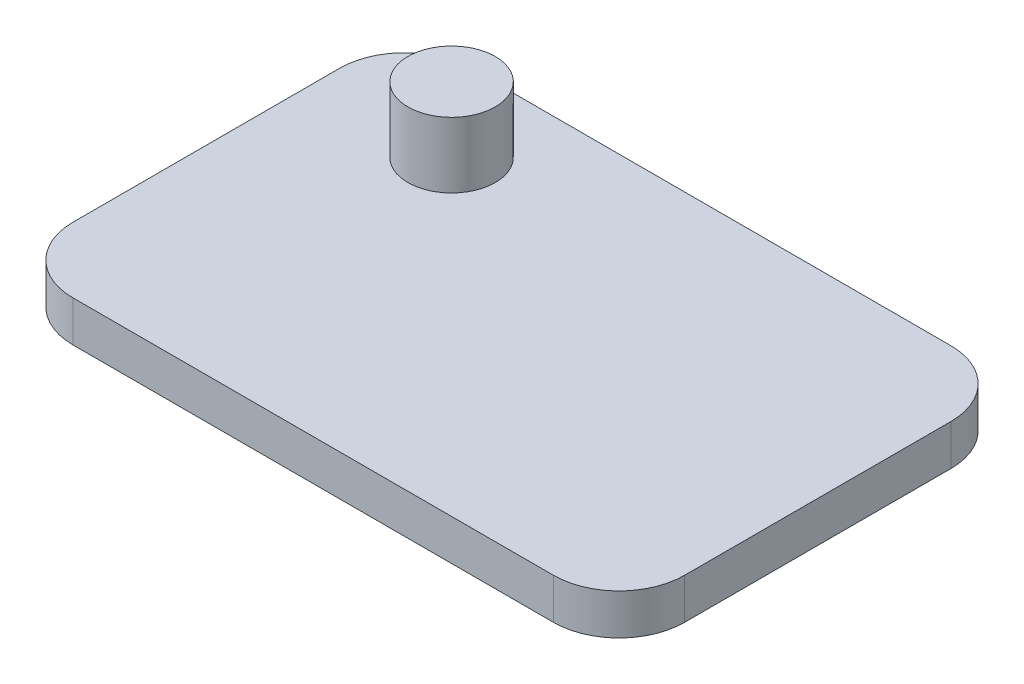
ISO-10303-21;
HEADER;
FILE_DESCRIPTION(('STEP AP214'),'2;1');
FILE_NAME('part.step','',(''),(''),'','','');
FILE_SCHEMA(('AUTOMOTIVE_DESIGN { 1 0 10303 214 1 1 1 1 }'));
ENDSEC;
DATA;
#1=APPLICATION_CONTEXT('core data for automotive mechanical design processes');
#2=APPLICATION_PROTOCOL_DEFINITION('international standard','automotive_design',2000,#1);
#3=PRODUCT_CONTEXT('',#1,'mechanical');
#4=PRODUCT('Part','Part','',(#3));
#5=PRODUCT_RELATED_PRODUCT_CATEGORY('part','',(#4));
#6=PRODUCT_DEFINITION_FORMATION('','',#4);
#7=PRODUCT_DEFINITION_CONTEXT('part definition',#1,'design');
#8=PRODUCT_DEFINITION('design','',#6,#7);
#9=PRODUCT_DEFINITION_SHAPE('','',#8);
#10=(LENGTH_UNIT() NAMED_UNIT(*) SI_UNIT(.MILLI.,.METRE.));
#11=(NAMED_UNIT(*) PLANE_ANGLE_UNIT() SI_UNIT($,.RADIAN.));
#12=(NAMED_UNIT(*) SI_UNIT($,.STERADIAN.) SOLID_ANGLE_UNIT());
#13=UNCERTAINTY_MEASURE_WITH_UNIT(LENGTH_MEASURE(1.E-05),#10,'distance_accuracy_value','');
#14=(GEOMETRIC_REPRESENTATION_CONTEXT(3) GLOBAL_UNCERTAINTY_ASSIGNED_CONTEXT((#13)) GLOBAL_UNIT_ASSIGNED_CONTEXT((#10,
#11,#12)) REPRESENTATION_CONTEXT('',''));
#15=CARTESIAN_POINT('',(0.,0.,0.));
#16=DIRECTION('',(0.,0.,1.));
#17=DIRECTION('',(1.,0.,0.));
#18=AXIS2_PLACEMENT_3D('',#15,#16,#17);
#19=CARTESIAN_POINT('',(-711.2,-94.8266666666667,462.28));
#20=DIRECTION('',(1.,0.,0.));
#21=DIRECTION('',(0.,0.,-1.));
#22=AXIS2_PLACEMENT_3D('',#19,#20,#21);
#23=PLANE('',#22);
#24=DIRECTION('',(0.,0.,-1.));
#25=VECTOR('',#24,1.);
#26=CARTESIAN_POINT('',(-711.2,0.,462.28));
#27=LINE('',#26,#25);
#28=CARTESIAN_POINT('',(-711.2,0.,309.88));
#29=VERTEX_POINT('',#28);
#30=CARTESIAN_POINT('',(-711.2,0.,-309.88));
#31=VERTEX_POINT('',#30);
#32=EDGE_CURVE('E127',#29,#31,#27,.T.);
#33=ORIENTED_EDGE('',*,*,#32,.T.);
#34=DIRECTION('',(0.,1.,0.));
#35=VECTOR('',#34,1.);
#36=CARTESIAN_POINT('',(-711.2,-94.8266666666667,-309.88));
#37=LINE('',#36,#35);
#38=CARTESIAN_POINT('',(-711.2,-94.8266666666667,-309.88));
#39=VERTEX_POINT('',#38);
#40=EDGE_CURVE('E105',#31,#39,#37,.F.);
#41=ORIENTED_EDGE('',*,*,#40,.T.);
#42=DIRECTION('',(0.,0.,-1.));
#43=VECTOR('',#42,1.);
#44=CARTESIAN_POINT('',(-711.2,-94.8266666666667,462.28));
#45=LINE('',#44,#43);
#46=CARTESIAN_POINT('',(-711.2,-94.8266666666667,309.88));
#47=VERTEX_POINT('',#46);
#48=EDGE_CURVE('E137',#47,#39,#45,.T.);
#49=ORIENTED_EDGE('',*,*,#48,.F.);
#50=DIRECTION('',(0.,1.,0.));
#51=VECTOR('',#50,1.);
#52=CARTESIAN_POINT('',(-711.2,0.,309.88));
#53=LINE('',#52,#51);
#54=EDGE_CURVE('E110',#47,#29,#53,.T.);
#55=ORIENTED_EDGE('',*,*,#54,.T.);
#56=EDGE_LOOP('',(#33,#41,#49,#55));
#57=FACE_BOUND('',#56,.T.);
#58=ADVANCED_FACE('F33',(#57),#23,.F.);
#59=CARTESIAN_POINT('',(-711.2,-94.8266666666667,-462.28));
#60=DIRECTION('',(0.,0.,1.));
#61=DIRECTION('',(1.,0.,0.));
#62=AXIS2_PLACEMENT_3D('',#59,#60,#61);
#63=PLANE('',#62);
#64=DIRECTION('',(1.,0.,0.));
#65=VECTOR('',#64,1.);
#66=CARTESIAN_POINT('',(-711.2,-94.8266666666667,-462.28));
#67=LINE('',#66,#65);
#68=CARTESIAN_POINT('',(-558.8,-94.8266666666667,-462.28));
#69=VERTEX_POINT('',#68);
#70=CARTESIAN_POINT('',(558.8,-94.8266666666667,-462.28));
#71=VERTEX_POINT('',#70);
#72=EDGE_CURVE('E120',#69,#71,#67,.T.);
#73=ORIENTED_EDGE('',*,*,#72,.F.);
#74=DIRECTION('',(0.,1.,0.));
#75=VECTOR('',#74,1.);
#76=CARTESIAN_POINT('',(-558.8,-94.8266666666667,-462.28));
#77=LINE('',#76,#75);
#78=CARTESIAN_POINT('',(-558.8,0.,-462.28));
#79=VERTEX_POINT('',#78);
#80=EDGE_CURVE('E104',#69,#79,#77,.T.);
#81=ORIENTED_EDGE('',*,*,#80,.T.);
#82=DIRECTION('',(1.,0.,0.));
#83=VECTOR('',#82,1.);
#84=CARTESIAN_POINT('',(-711.2,0.,-462.28));
#85=LINE('',#84,#83);
#86=CARTESIAN_POINT('',(558.8,0.,-462.28));
#87=VERTEX_POINT('',#86);
#88=EDGE_CURVE('E117',#79,#87,#85,.T.);
#89=ORIENTED_EDGE('',*,*,#88,.T.);
#90=DIRECTION('',(0.,1.,0.));
#91=VECTOR('',#90,1.);
#92=CARTESIAN_POINT('',(558.8,-94.8266666666667,-462.28));
#93=LINE('',#92,#91);
#94=EDGE_CURVE('E122',#87,#71,#93,.F.);
#95=ORIENTED_EDGE('',*,*,#94,.T.);
#96=EDGE_LOOP('',(#73,#81,#89,#95));
#97=FACE_BOUND('',#96,.T.);
#98=ADVANCED_FACE('F116',(#97),#63,.F.);
#99=CARTESIAN_POINT('',(711.2,-94.8266666666667,462.28));
#100=DIRECTION('',(1.,0.,0.));
#101=DIRECTION('',(0.,0.,-1.));
#102=AXIS2_PLACEMENT_3D('',#99,#100,#101);
#103=PLANE('',#102);
#104=DIRECTION('',(0.,0.,-1.));
#105=VECTOR('',#104,1.);
#106=CARTESIAN_POINT('',(711.2,-94.8266666666667,462.28));
#107=LINE('',#106,#105);
#108=CARTESIAN_POINT('',(711.2,-94.8266666666667,309.88));
#109=VERTEX_POINT('',#108);
#110=CARTESIAN_POINT('',(711.2,-94.8266666666667,-309.88));
#111=VERTEX_POINT('',#110);
#112=EDGE_CURVE('E171',#109,#111,#107,.T.);
#113=ORIENTED_EDGE('',*,*,#112,.T.);
#114=DIRECTION('',(0.,1.,0.));
#115=VECTOR('',#114,1.);
#116=CARTESIAN_POINT('',(711.2,0.,-309.88));
#117=LINE('',#116,#115);
#118=CARTESIAN_POINT('',(711.2,0.,-309.88));
#119=VERTEX_POINT('',#118);
#120=EDGE_CURVE('E156',#111,#119,#117,.T.);
#121=ORIENTED_EDGE('',*,*,#120,.T.);
#122=DIRECTION('',(0.,0.,-1.));
#123=VECTOR('',#122,1.);
#124=CARTESIAN_POINT('',(711.2,0.,462.28));
#125=LINE('',#124,#123);
#126=CARTESIAN_POINT('',(711.2,0.,309.88));
#127=VERTEX_POINT('',#126);
#128=EDGE_CURVE('E126',#127,#119,#125,.T.);
#129=ORIENTED_EDGE('',*,*,#128,.F.);
#130=DIRECTION('',(0.,1.,0.));
#131=VECTOR('',#130,1.);
#132=CARTESIAN_POINT('',(711.2,-94.8266666666667,309.88));
#133=LINE('',#132,#131);
#134=EDGE_CURVE('E154',#127,#109,#133,.F.);
#135=ORIENTED_EDGE('',*,*,#134,.T.);
#136=EDGE_LOOP('',(#113,#121,#129,#135));
#137=FACE_BOUND('',#136,.T.);
#138=ADVANCED_FACE('F178',(#137),#103,.T.);
#139=CARTESIAN_POINT('',(-711.2,-94.8266666666667,462.28));
#140=DIRECTION('',(0.,0.,1.));
#141=DIRECTION('',(1.,0.,0.));
#142=AXIS2_PLACEMENT_3D('',#139,#140,#141);
#143=PLANE('',#142);
#144=DIRECTION('',(1.,0.,0.));
#145=VECTOR('',#144,1.);
#146=CARTESIAN_POINT('',(-711.2,-94.8266666666667,462.28));
#147=LINE('',#146,#145);
#148=CARTESIAN_POINT('',(-558.8,-94.8266666666667,462.28));
#149=VERTEX_POINT('',#148);
#150=CARTESIAN_POINT('',(558.8,-94.8266666666667,462.28));
#151=VERTEX_POINT('',#150);
#152=EDGE_CURVE('E138',#149,#151,#147,.T.);
#153=ORIENTED_EDGE('',*,*,#152,.T.);
#154=DIRECTION('',(0.,1.,0.));
#155=VECTOR('',#154,1.);
#156=CARTESIAN_POINT('',(558.8,-94.8266666666667,462.28));
#157=LINE('',#156,#155);
#158=CARTESIAN_POINT('',(558.8,0.,462.28));
#159=VERTEX_POINT('',#158);
#160=EDGE_CURVE('E41',#151,#159,#157,.T.);
#161=ORIENTED_EDGE('',*,*,#160,.T.);
#162=DIRECTION('',(1.,0.,0.));
#163=VECTOR('',#162,1.);
#164=CARTESIAN_POINT('',(-711.2,0.,462.28));
#165=LINE('',#164,#163);
#166=CARTESIAN_POINT('',(-558.8,0.,462.28));
#167=VERTEX_POINT('',#166);
#168=EDGE_CURVE('E129',#167,#159,#165,.T.);
#169=ORIENTED_EDGE('',*,*,#168,.F.);
#170=DIRECTION('',(0.,1.,0.));
#171=VECTOR('',#170,1.);
#172=CARTESIAN_POINT('',(-558.8,-94.8266666666667,462.28));
#173=LINE('',#172,#171);
#174=EDGE_CURVE('E55',#167,#149,#173,.F.);
#175=ORIENTED_EDGE('',*,*,#174,.T.);
#176=EDGE_LOOP('',(#153,#161,#169,#175));
#177=FACE_BOUND('',#176,.T.);
#178=ADVANCED_FACE('F161',(#177),#143,.T.);
#179=CARTESIAN_POINT('',(0.,-94.8266666666667,0.));
#180=DIRECTION('',(0.,-1.,0.));
#181=DIRECTION('',(0.,0.,-1.));
#182=AXIS2_PLACEMENT_3D('',#179,#180,#181);
#183=PLANE('',#182);
#184=ORIENTED_EDGE('',*,*,#48,.T.);
#185=CARTESIAN_POINT('',(-558.8,-94.8266666666667,-309.88));
#186=DIRECTION('',(0.,-1.,0.));
#187=DIRECTION('',(0.,0.,-1.));
#188=AXIS2_PLACEMENT_3D('',#185,#186,#187);
#189=CIRCLE('',#188,152.4);
#190=EDGE_CURVE('E152',#39,#69,#189,.T.);
#191=ORIENTED_EDGE('',*,*,#190,.T.);
#192=ORIENTED_EDGE('',*,*,#72,.T.);
#193=CARTESIAN_POINT('',(558.8,-94.8266666666667,-309.88));
#194=DIRECTION('',(0.,-1.,0.));
#195=DIRECTION('',(0.,0.,-1.));
#196=AXIS2_PLACEMENT_3D('',#193,#194,#195);
#197=CIRCLE('',#196,152.4);
#198=EDGE_CURVE('E150',#71,#111,#197,.T.);
#199=ORIENTED_EDGE('',*,*,#198,.T.);
#200=ORIENTED_EDGE('',*,*,#112,.F.);
#201=CARTESIAN_POINT('',(558.8,-94.8266666666667,309.88));
#202=DIRECTION('',(0.,-1.,0.));
#203=DIRECTION('',(0.,0.,-1.));
#204=AXIS2_PLACEMENT_3D('',#201,#202,#203);
#205=CIRCLE('',#204,152.4);
#206=EDGE_CURVE('E48',#109,#151,#205,.T.);
#207=ORIENTED_EDGE('',*,*,#206,.T.);
#208=ORIENTED_EDGE('',*,*,#152,.F.);
#209=CARTESIAN_POINT('',(-558.8,-94.8266666666667,309.88));
#210=DIRECTION('',(0.,-1.,0.));
#211=DIRECTION('',(0.,0.,-1.));
#212=AXIS2_PLACEMENT_3D('',#209,#210,#211);
#213=CIRCLE('',#212,152.4);
#214=EDGE_CURVE('E147',#149,#47,#213,.T.);
#215=ORIENTED_EDGE('',*,*,#214,.T.);
#216=EDGE_LOOP('',(#184,#191,#192,#199,#200,#207,#208,#215));
#217=FACE_BOUND('',#216,.T.);
#218=ADVANCED_FACE('F183',(#217),#183,.T.);
#219=CARTESIAN_POINT('',(0.,0.,0.));
#220=DIRECTION('',(0.,-1.,0.));
#221=DIRECTION('',(0.,0.,-1.));
#222=AXIS2_PLACEMENT_3D('',#219,#220,#221);
#223=PLANE('',#222);
#224=CARTESIAN_POINT('',(-401.553909640909,0.,-261.010041266591));
#225=DIRECTION('',(0.,-1.,0.));
#226=DIRECTION('',(0.,0.,-1.));
#227=AXIS2_PLACEMENT_3D('',#224,#225,#226);
#228=CIRCLE('',#227,101.6);
#229=CARTESIAN_POINT('',(-401.553909640909,0.,-362.610041266591));
#230=VERTEX_POINT('',#229);
#231=EDGE_CURVE('E11',#230,#230,#228,.F.);
#232=ORIENTED_EDGE('',*,*,#231,.F.);
#233=EDGE_LOOP('',(#232));
#234=FACE_BOUND('',#233,.T.);
#235=ORIENTED_EDGE('',*,*,#88,.F.);
#236=CARTESIAN_POINT('',(-558.8,0.,-309.88));
#237=DIRECTION('',(0.,-1.,0.));
#238=DIRECTION('',(0.,0.,-1.));
#239=AXIS2_PLACEMENT_3D('',#236,#237,#238);
#240=CIRCLE('',#239,152.4);
#241=EDGE_CURVE('E100',#79,#31,#240,.F.);
#242=ORIENTED_EDGE('',*,*,#241,.T.);
#243=ORIENTED_EDGE('',*,*,#32,.F.);
#244=CARTESIAN_POINT('',(-558.8,0.,309.88));
#245=DIRECTION('',(0.,-1.,0.));
#246=DIRECTION('',(0.,0.,-1.));
#247=AXIS2_PLACEMENT_3D('',#244,#245,#246);
#248=CIRCLE('',#247,152.4);
#249=EDGE_CURVE('E121',#29,#167,#248,.F.);
#250=ORIENTED_EDGE('',*,*,#249,.T.);
#251=ORIENTED_EDGE('',*,*,#168,.T.);
#252=CARTESIAN_POINT('',(558.8,0.,309.88));
#253=DIRECTION('',(0.,-1.,0.));
#254=DIRECTION('',(0.,0.,-1.));
#255=AXIS2_PLACEMENT_3D('',#252,#253,#254);
#256=CIRCLE('',#255,152.4);
#257=EDGE_CURVE('E141',#159,#127,#256,.F.);
#258=ORIENTED_EDGE('',*,*,#257,.T.);
#259=ORIENTED_EDGE('',*,*,#128,.T.);
#260=CARTESIAN_POINT('',(558.8,0.,-309.88));
#261=DIRECTION('',(0.,-1.,0.));
#262=DIRECTION('',(0.,0.,-1.));
#263=AXIS2_PLACEMENT_3D('',#260,#261,#262);
#264=CIRCLE('',#263,152.4);
#265=EDGE_CURVE('E111',#119,#87,#264,.F.);
#266=ORIENTED_EDGE('',*,*,#265,.T.);
#267=EDGE_LOOP('',(#235,#242,#243,#250,#251,#258,#259,#266));
#268=FACE_BOUND('',#267,.T.);
#269=ADVANCED_FACE('F124',(#234,#268),#223,.F.);
#270=CARTESIAN_POINT('',(-558.8,-94.8266666666667,-309.88));
#271=DIRECTION('',(0.,1.,0.));
#272=DIRECTION('',(0.,0.,1.));
#273=AXIS2_PLACEMENT_3D('',#270,#271,#272);
#274=CYLINDRICAL_SURFACE('',#273,152.4);
#275=ORIENTED_EDGE('',*,*,#190,.F.);
#276=ORIENTED_EDGE('',*,*,#40,.F.);
#277=ORIENTED_EDGE('',*,*,#241,.F.);
#278=ORIENTED_EDGE('',*,*,#80,.F.);
#279=EDGE_LOOP('',(#275,#276,#277,#278));
#280=FACE_BOUND('',#279,.T.);
#281=ADVANCED_FACE('F103',(#280),#274,.T.);
#282=CARTESIAN_POINT('',(558.8,-94.8266666666667,-309.88));
#283=DIRECTION('',(0.,-1.,0.));
#284=DIRECTION('',(0.,0.,-1.));
#285=AXIS2_PLACEMENT_3D('',#282,#283,#284);
#286=CYLINDRICAL_SURFACE('',#285,152.4);
#287=ORIENTED_EDGE('',*,*,#198,.F.);
#288=ORIENTED_EDGE('',*,*,#94,.F.);
#289=ORIENTED_EDGE('',*,*,#265,.F.);
#290=ORIENTED_EDGE('',*,*,#120,.F.);
#291=EDGE_LOOP('',(#287,#288,#289,#290));
#292=FACE_BOUND('',#291,.T.);
#293=ADVANCED_FACE('F182',(#292),#286,.T.);
#294=CARTESIAN_POINT('',(558.8,-94.8266666666667,309.88));
#295=DIRECTION('',(0.,1.,0.));
#296=DIRECTION('',(0.,0.,1.));
#297=AXIS2_PLACEMENT_3D('',#294,#295,#296);
#298=CYLINDRICAL_SURFACE('',#297,152.4);
#299=ORIENTED_EDGE('',*,*,#206,.F.);
#300=ORIENTED_EDGE('',*,*,#134,.F.);
#301=ORIENTED_EDGE('',*,*,#257,.F.);
#302=ORIENTED_EDGE('',*,*,#160,.F.);
#303=EDGE_LOOP('',(#299,#300,#301,#302));
#304=FACE_BOUND('',#303,.T.);
#305=ADVANCED_FACE('F206',(#304),#298,.T.);
#306=CARTESIAN_POINT('',(-558.8,-94.8266666666667,309.88));
#307=DIRECTION('',(0.,-1.,0.));
#308=DIRECTION('',(0.,0.,-1.));
#309=AXIS2_PLACEMENT_3D('',#306,#307,#308);
#310=CYLINDRICAL_SURFACE('',#309,152.4);
#311=ORIENTED_EDGE('',*,*,#214,.F.);
#312=ORIENTED_EDGE('',*,*,#174,.F.);
#313=ORIENTED_EDGE('',*,*,#249,.F.);
#314=ORIENTED_EDGE('',*,*,#54,.F.);
#315=EDGE_LOOP('',(#311,#312,#313,#314));
#316=FACE_BOUND('',#315,.T.);
#317=ADVANCED_FACE('F35',(#316),#310,.T.);
#318=CARTESIAN_POINT('',(-401.553909640909,152.4,-261.010041266591));
#319=DIRECTION('',(0.,-1.,0.));
#320=DIRECTION('',(0.,0.,-1.));
#321=AXIS2_PLACEMENT_3D('',#318,#319,#320);
#322=CYLINDRICAL_SURFACE('',#321,101.6);
#323=CARTESIAN_POINT('',(-401.553909640909,152.4,-261.010041266591));
#324=DIRECTION('',(0.,1.,0.));
#325=DIRECTION('',(0.,0.,1.));
#326=AXIS2_PLACEMENT_3D('',#323,#324,#325);
#327=CIRCLE('',#326,101.6);
#328=CARTESIAN_POINT('',(-401.553909640909,152.4,-362.610041266591));
#329=VERTEX_POINT('',#328);
#330=EDGE_CURVE('E131',#329,#329,#327,.T.);
#331=CARTESIAN_POINT('',(-401.553909640909,152.4,-362.610041266591));
#332=CARTESIAN_POINT('',(-401.553909640909,150.8125,-362.610041266591));
#333=CARTESIAN_POINT('',(-401.553909640909,149.225,-362.610041266591));
#334=CARTESIAN_POINT('',(-401.553909640909,146.05,-362.610041266591));
#335=CARTESIAN_POINT('',(-401.553909640909,144.4625,-362.610041266591));
#336=CARTESIAN_POINT('',(-401.553909640909,141.2875,-362.610041266591));
#337=CARTESIAN_POINT('',(-401.553909640909,139.7,-362.610041266591));
#338=CARTESIAN_POINT('',(-401.553909640909,136.525,-362.610041266591));
#339=CARTESIAN_POINT('',(-401.553909640909,134.9375,-362.610041266591));
#340=CARTESIAN_POINT('',(-401.553909640909,131.7625,-362.610041266591));
#341=CARTESIAN_POINT('',(-401.553909640909,130.175,-362.610041266591));
#342=CARTESIAN_POINT('',(-401.553909640909,127.,-362.610041266591));
#343=CARTESIAN_POINT('',(-401.553909640909,125.4125,-362.610041266591));
#344=CARTESIAN_POINT('',(-401.553909640909,122.2375,-362.610041266591));
#345=CARTESIAN_POINT('',(-401.553909640909,120.65,-362.610041266591));
#346=CARTESIAN_POINT('',(-401.553909640909,117.475,-362.610041266591));
#347=CARTESIAN_POINT('',(-401.553909640909,115.8875,-362.610041266591));
#348=CARTESIAN_POINT('',(-401.553909640909,112.7125,-362.610041266591));
#349=CARTESIAN_POINT('',(-401.553909640909,111.125,-362.610041266591));
#350=CARTESIAN_POINT('',(-401.553909640909,107.95,-362.610041266591));
#351=CARTESIAN_POINT('',(-401.553909640909,106.3625,-362.610041266591));
#352=CARTESIAN_POINT('',(-401.553909640909,103.1875,-362.610041266591));
#353=CARTESIAN_POINT('',(-401.553909640909,101.6,-362.610041266591));
#354=CARTESIAN_POINT('',(-401.553909640909,98.425,-362.610041266591));
#355=CARTESIAN_POINT('',(-401.553909640909,96.8375,-362.610041266591));
#356=CARTESIAN_POINT('',(-401.553909640909,93.6625,-362.610041266591));
#357=CARTESIAN_POINT('',(-401.553909640909,92.075,-362.610041266591));
#358=CARTESIAN_POINT('',(-401.553909640909,88.9,-362.610041266591));
#359=CARTESIAN_POINT('',(-401.553909640909,87.3125,-362.610041266591));
#360=CARTESIAN_POINT('',(-401.553909640909,84.1375,-362.610041266591));
#361=CARTESIAN_POINT('',(-401.553909640909,82.55,-362.610041266591));
#362=CARTESIAN_POINT('',(-401.553909640909,79.375,-362.610041266591));
#363=CARTESIAN_POINT('',(-401.553909640909,77.7875,-362.610041266591));
#364=CARTESIAN_POINT('',(-401.553909640909,74.6125,-362.610041266591));
#365=CARTESIAN_POINT('',(-401.553909640909,73.025,-362.610041266591));
#366=CARTESIAN_POINT('',(-401.553909640909,69.85,-362.610041266591));
#367=CARTESIAN_POINT('',(-401.553909640909,68.2625,-362.610041266591));
#368=CARTESIAN_POINT('',(-401.553909640909,65.0875,-362.610041266591));
#369=CARTESIAN_POINT('',(-401.553909640909,63.5,-362.610041266591));
#370=CARTESIAN_POINT('',(-401.553909640909,60.325,-362.610041266591));
#371=CARTESIAN_POINT('',(-401.553909640909,58.7375,-362.610041266591));
#372=CARTESIAN_POINT('',(-401.553909640909,55.5625,-362.610041266591));
#373=CARTESIAN_POINT('',(-401.553909640909,53.975,-362.610041266591));
#374=CARTESIAN_POINT('',(-401.553909640909,50.8,-362.610041266591));
#375=CARTESIAN_POINT('',(-401.553909640909,49.2125,-362.610041266591));
#376=CARTESIAN_POINT('',(-401.553909640909,46.0375,-362.610041266591));
#377=CARTESIAN_POINT('',(-401.553909640909,44.45,-362.610041266591));
#378=CARTESIAN_POINT('',(-401.553909640909,41.275,-362.610041266591));
#379=CARTESIAN_POINT('',(-401.553909640909,39.6875,-362.610041266591));
#380=CARTESIAN_POINT('',(-401.553909640909,36.5125,-362.610041266591));
#381=CARTESIAN_POINT('',(-401.553909640909,34.925,-362.610041266591));
#382=CARTESIAN_POINT('',(-401.553909640909,31.75,-362.610041266591));
#383=CARTESIAN_POINT('',(-401.553909640909,30.1625,-362.610041266591));
#384=CARTESIAN_POINT('',(-401.553909640909,26.9875,-362.610041266591));
#385=CARTESIAN_POINT('',(-401.553909640909,25.4,-362.610041266591));
#386=CARTESIAN_POINT('',(-401.553909640909,22.225,-362.610041266591));
#387=CARTESIAN_POINT('',(-401.553909640909,20.6375,-362.610041266591));
#388=CARTESIAN_POINT('',(-401.553909640909,17.4625,-362.610041266591));
#389=CARTESIAN_POINT('',(-401.553909640909,15.875,-362.610041266591));
#390=CARTESIAN_POINT('',(-401.553909640909,12.7,-362.610041266591));
#391=CARTESIAN_POINT('',(-401.553909640909,11.1125,-362.610041266591));
#392=CARTESIAN_POINT('',(-401.553909640909,7.93750000000001,-362.610041266591));
#393=CARTESIAN_POINT('',(-401.553909640909,6.35,-362.610041266591));
#394=CARTESIAN_POINT('',(-401.553909640909,3.175,-362.610041266591));
#395=CARTESIAN_POINT('',(-401.553909640909,1.5875,-362.610041266591));
#396=CARTESIAN_POINT('',(-401.553909640909,0.,-362.610041266591));
#397=B_SPLINE_CURVE_WITH_KNOTS('',3,(#331,#332,#333,#334,#335,#336,#337,#338,#339,#340,#341,
#342,#343,#344,#345,#346,#347,#348,#349,#350,#351,#352,#353,#354,#355,#356,#357,#358,#359,#360,
#361,#362,#363,#364,#365,#366,#367,#368,#369,#370,#371,#372,#373,#374,#375,#376,#377,#378,#379,
#380,#381,#382,#383,#384,#385,#386,#387,#388,#389,#390,#391,#392,#393,#394,#395,#396),
.UNSPECIFIED.,.F.,.F.,(4,2,2,2,2,2,2,2,2,2,2,2,2,2,2,2,2,2,2,2,2,2,2,2,2,2,2,2,2,2,2,2,4),(0.,
4.76249999999998,9.52499999999998,14.2875,19.05,23.8125,28.575,33.3375,38.1,42.8625,47.625,
52.3875,57.15,61.9125,66.675,71.4375,76.2,80.9625,85.725,90.4875,95.25,100.0125,104.775,
109.5375,114.3,119.0625,123.825,128.5875,133.35,138.1125,142.875,147.6375,152.4),.UNSPECIFIED.);
#398=EDGE_CURVE('BSEAM211',#329,#230,#397,.T.);
#399=ORIENTED_EDGE('',*,*,#330,.F.);
#400=ORIENTED_EDGE('',*,*,#231,.T.);
#401=ORIENTED_EDGE('',*,*,#398,.T.);
#402=ORIENTED_EDGE('',*,*,#398,.F.);
#403=EDGE_LOOP('',(#399,#401,#400,#402));
#404=FACE_BOUND('',#403,.T.);
#405=ADVANCED_FACE('F211',(#404),#322,.T.);
#406=CARTESIAN_POINT('',(-401.553909640909,152.4,-261.010041266591));
#407=DIRECTION('',(0.,1.,0.));
#408=DIRECTION('',(0.,0.,1.));
#409=AXIS2_PLACEMENT_3D('',#406,#407,#408);
#410=PLANE('',#409);
#411=ORIENTED_EDGE('',*,*,#330,.T.);
#412=EDGE_LOOP('',(#411));
#413=FACE_BOUND('',#412,.T.);
#414=ADVANCED_FACE('F215',(#413),#410,.T.);
#415=CLOSED_SHELL('',(#58,#98,#138,#178,#218,#269,#281,#293,#305,#317,#405,#414));
#416=MANIFOLD_SOLID_BREP('B2',#415);
#417=ADVANCED_BREP_SHAPE_REPRESENTATION('',(#18,#416),#14);
#418=SHAPE_DEFINITION_REPRESENTATION(#9,#417);
ENDSEC;
END-ISO-10303-21;
